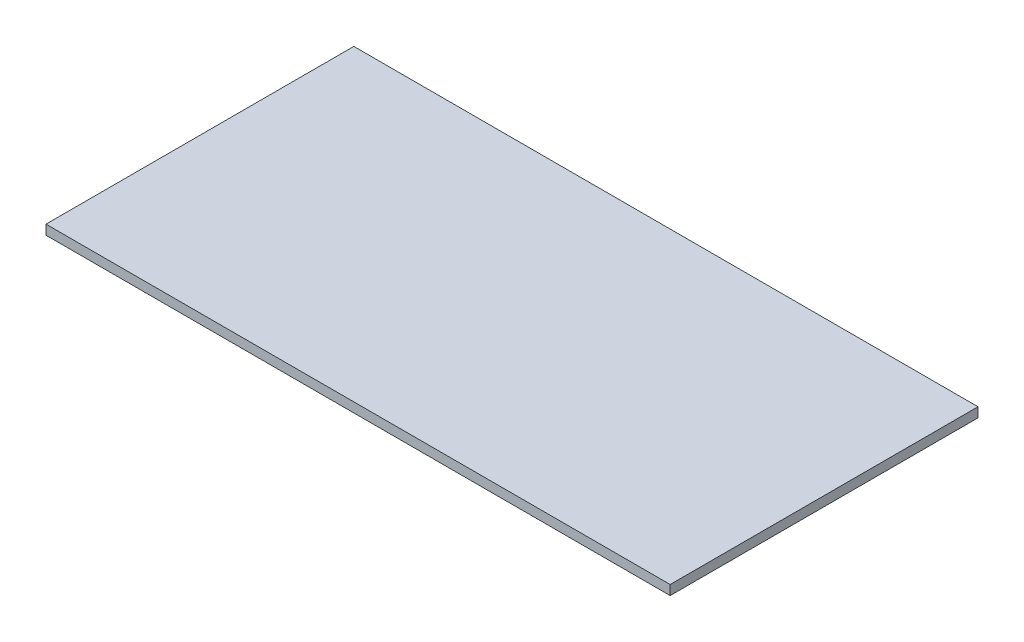
ISO-10303-21;
HEADER;
FILE_DESCRIPTION(('STEP AP214'),'2;1');
FILE_NAME('part.step','',(''),(''),'','','');
FILE_SCHEMA(('AUTOMOTIVE_DESIGN { 1 0 10303 214 1 1 1 1 }'));
ENDSEC;
DATA;
#1=APPLICATION_CONTEXT('core data for automotive mechanical design processes');
#2=APPLICATION_PROTOCOL_DEFINITION('international standard','automotive_design',2000,#1);
#3=PRODUCT_CONTEXT('',#1,'mechanical');
#4=PRODUCT('Part','Part','',(#3));
#5=PRODUCT_RELATED_PRODUCT_CATEGORY('part','',(#4));
#6=PRODUCT_DEFINITION_FORMATION('','',#4);
#7=PRODUCT_DEFINITION_CONTEXT('part definition',#1,'design');
#8=PRODUCT_DEFINITION('design','',#6,#7);
#9=PRODUCT_DEFINITION_SHAPE('','',#8);
#10=(LENGTH_UNIT() NAMED_UNIT(*) SI_UNIT(.MILLI.,.METRE.));
#11=(NAMED_UNIT(*) PLANE_ANGLE_UNIT() SI_UNIT($,.RADIAN.));
#12=(NAMED_UNIT(*) SI_UNIT($,.STERADIAN.) SOLID_ANGLE_UNIT());
#13=UNCERTAINTY_MEASURE_WITH_UNIT(LENGTH_MEASURE(1.E-05),#10,'distance_accuracy_value','');
#14=(GEOMETRIC_REPRESENTATION_CONTEXT(3) GLOBAL_UNCERTAINTY_ASSIGNED_CONTEXT((#13)) GLOBAL_UNIT_ASSIGNED_CONTEXT((#10,
#11,#12)) REPRESENTATION_CONTEXT('',''));
#15=CARTESIAN_POINT('',(0.,0.,0.));
#16=DIRECTION('',(0.,0.,1.));
#17=DIRECTION('',(1.,0.,0.));
#18=AXIS2_PLACEMENT_3D('',#15,#16,#17);
#19=CARTESIAN_POINT('',(-59.1289481870499,4.7625,-123.999481579448));
#20=DIRECTION('',(1.,0.,0.));
#21=DIRECTION('',(0.,0.,-1.));
#22=AXIS2_PLACEMENT_3D('',#19,#20,#21);
#23=PLANE('',#22);
#24=DIRECTION('',(0.,0.,1.));
#25=VECTOR('',#24,1.);
#26=CARTESIAN_POINT('',(-59.1289481870499,0.,-123.999481579448));
#27=LINE('',#26,#25);
#28=CARTESIAN_POINT('',(-59.1289481870499,0.,-123.999481579448));
#29=VERTEX_POINT('',#28);
#30=CARTESIAN_POINT('',(-59.1289481870498,0.,28.4005184205515));
#31=VERTEX_POINT('',#30);
#32=EDGE_CURVE('E98',#29,#31,#27,.T.);
#33=ORIENTED_EDGE('',*,*,#32,.T.);
#34=DIRECTION('',(0.,-1.,0.));
#35=VECTOR('',#34,1.);
#36=CARTESIAN_POINT('',(-59.1289481870498,4.7625,28.4005184205515));
#37=LINE('',#36,#35);
#38=CARTESIAN_POINT('',(-59.1289481870498,4.7625,28.4005184205515));
#39=VERTEX_POINT('',#38);
#40=EDGE_CURVE('E11',#39,#31,#37,.T.);
#41=ORIENTED_EDGE('',*,*,#40,.F.);
#42=DIRECTION('',(0.,0.,1.));
#43=VECTOR('',#42,1.);
#44=CARTESIAN_POINT('',(-59.1289481870499,4.7625,-123.999481579448));
#45=LINE('',#44,#43);
#46=CARTESIAN_POINT('',(-59.1289481870499,4.7625,-123.999481579448));
#47=VERTEX_POINT('',#46);
#48=EDGE_CURVE('E86',#47,#39,#45,.T.);
#49=ORIENTED_EDGE('',*,*,#48,.F.);
#50=DIRECTION('',(0.,-1.,0.));
#51=VECTOR('',#50,1.);
#52=CARTESIAN_POINT('',(-59.1289481870499,4.7625,-123.999481579448));
#53=LINE('',#52,#51);
#54=EDGE_CURVE('E94',#47,#29,#53,.T.);
#55=ORIENTED_EDGE('',*,*,#54,.T.);
#56=EDGE_LOOP('',(#33,#41,#49,#55));
#57=FACE_BOUND('',#56,.T.);
#58=ADVANCED_FACE('F35',(#57),#23,.F.);
#59=CARTESIAN_POINT('',(-59.1289481870498,4.7625,28.4005184205515));
#60=DIRECTION('',(0.,0.,-1.));
#61=DIRECTION('',(-1.,0.,0.));
#62=AXIS2_PLACEMENT_3D('',#59,#60,#61);
#63=PLANE('',#62);
#64=DIRECTION('',(1.,0.,0.));
#65=VECTOR('',#64,1.);
#66=CARTESIAN_POINT('',(-59.1289481870498,0.,28.4005184205515));
#67=LINE('',#66,#65);
#68=CARTESIAN_POINT('',(249.87105181295,0.,28.4005184205515));
#69=VERTEX_POINT('',#68);
#70=EDGE_CURVE('E90',#31,#69,#67,.T.);
#71=ORIENTED_EDGE('',*,*,#70,.T.);
#72=DIRECTION('',(0.,-1.,0.));
#73=VECTOR('',#72,1.);
#74=CARTESIAN_POINT('',(249.87105181295,4.7625,28.4005184205515));
#75=LINE('',#74,#73);
#76=CARTESIAN_POINT('',(249.87105181295,4.7625,28.4005184205515));
#77=VERTEX_POINT('',#76);
#78=EDGE_CURVE('E43',#77,#69,#75,.T.);
#79=ORIENTED_EDGE('',*,*,#78,.F.);
#80=DIRECTION('',(1.,0.,0.));
#81=VECTOR('',#80,1.);
#82=CARTESIAN_POINT('',(-59.1289481870498,4.7625,28.4005184205515));
#83=LINE('',#82,#81);
#84=EDGE_CURVE('E81',#39,#77,#83,.T.);
#85=ORIENTED_EDGE('',*,*,#84,.F.);
#86=ORIENTED_EDGE('',*,*,#40,.T.);
#87=EDGE_LOOP('',(#71,#79,#85,#86));
#88=FACE_BOUND('',#87,.T.);
#89=ADVANCED_FACE('F89',(#88),#63,.F.);
#90=CARTESIAN_POINT('',(249.87105181295,4.7625,-123.999481579448));
#91=DIRECTION('',(-1.,0.,0.));
#92=DIRECTION('',(0.,0.,1.));
#93=AXIS2_PLACEMENT_3D('',#90,#91,#92);
#94=PLANE('',#93);
#95=DIRECTION('',(0.,0.,-1.));
#96=VECTOR('',#95,1.);
#97=CARTESIAN_POINT('',(249.87105181295,0.,-123.999481579448));
#98=LINE('',#97,#96);
#99=CARTESIAN_POINT('',(249.87105181295,0.,-123.999481579448));
#100=VERTEX_POINT('',#99);
#101=EDGE_CURVE('E68',#69,#100,#98,.T.);
#102=ORIENTED_EDGE('',*,*,#101,.T.);
#103=DIRECTION('',(0.,-1.,0.));
#104=VECTOR('',#103,1.);
#105=CARTESIAN_POINT('',(249.87105181295,4.7625,-123.999481579448));
#106=LINE('',#105,#104);
#107=CARTESIAN_POINT('',(249.87105181295,4.7625,-123.999481579448));
#108=VERTEX_POINT('',#107);
#109=EDGE_CURVE('E91',#108,#100,#106,.T.);
#110=ORIENTED_EDGE('',*,*,#109,.F.);
#111=DIRECTION('',(0.,0.,-1.));
#112=VECTOR('',#111,1.);
#113=CARTESIAN_POINT('',(249.87105181295,4.7625,-123.999481579448));
#114=LINE('',#113,#112);
#115=EDGE_CURVE('E84',#77,#108,#114,.T.);
#116=ORIENTED_EDGE('',*,*,#115,.F.);
#117=ORIENTED_EDGE('',*,*,#78,.T.);
#118=EDGE_LOOP('',(#102,#110,#116,#117));
#119=FACE_BOUND('',#118,.T.);
#120=ADVANCED_FACE('F92',(#119),#94,.F.);
#121=CARTESIAN_POINT('',(-59.1289481870499,4.7625,-123.999481579448));
#122=DIRECTION('',(0.,0.,1.));
#123=DIRECTION('',(1.,0.,0.));
#124=AXIS2_PLACEMENT_3D('',#121,#122,#123);
#125=PLANE('',#124);
#126=DIRECTION('',(-1.,0.,0.));
#127=VECTOR('',#126,1.);
#128=CARTESIAN_POINT('',(-59.1289481870499,0.,-123.999481579448));
#129=LINE('',#128,#127);
#130=EDGE_CURVE('E74',#100,#29,#129,.T.);
#131=ORIENTED_EDGE('',*,*,#130,.T.);
#132=ORIENTED_EDGE('',*,*,#54,.F.);
#133=DIRECTION('',(-1.,0.,0.));
#134=VECTOR('',#133,1.);
#135=CARTESIAN_POINT('',(-59.1289481870499,4.7625,-123.999481579448));
#136=LINE('',#135,#134);
#137=EDGE_CURVE('E51',#108,#47,#136,.T.);
#138=ORIENTED_EDGE('',*,*,#137,.F.);
#139=ORIENTED_EDGE('',*,*,#109,.T.);
#140=EDGE_LOOP('',(#131,#132,#138,#139));
#141=FACE_BOUND('',#140,.T.);
#142=ADVANCED_FACE('F105',(#141),#125,.F.);
#143=CARTESIAN_POINT('',(0.,4.7625,0.));
#144=DIRECTION('',(0.,1.,0.));
#145=DIRECTION('',(0.,0.,1.));
#146=AXIS2_PLACEMENT_3D('',#143,#144,#145);
#147=PLANE('',#146);
#148=ORIENTED_EDGE('',*,*,#48,.T.);
#149=ORIENTED_EDGE('',*,*,#84,.T.);
#150=ORIENTED_EDGE('',*,*,#115,.T.);
#151=ORIENTED_EDGE('',*,*,#137,.T.);
#152=EDGE_LOOP('',(#148,#149,#150,#151));
#153=FACE_BOUND('',#152,.T.);
#154=ADVANCED_FACE('F82',(#153),#147,.T.);
#155=CARTESIAN_POINT('',(0.,0.,0.));
#156=DIRECTION('',(0.,1.,0.));
#157=DIRECTION('',(0.,0.,1.));
#158=AXIS2_PLACEMENT_3D('',#155,#156,#157);
#159=PLANE('',#158);
#160=ORIENTED_EDGE('',*,*,#32,.F.);
#161=ORIENTED_EDGE('',*,*,#130,.F.);
#162=ORIENTED_EDGE('',*,*,#101,.F.);
#163=ORIENTED_EDGE('',*,*,#70,.F.);
#164=EDGE_LOOP('',(#160,#161,#162,#163));
#165=FACE_BOUND('',#164,.T.);
#166=ADVANCED_FACE('F108',(#165),#159,.F.);
#167=CLOSED_SHELL('',(#58,#89,#120,#142,#154,#166));
#168=MANIFOLD_SOLID_BREP('B2',#167);
#169=ADVANCED_BREP_SHAPE_REPRESENTATION('',(#18,#168),#14);
#170=SHAPE_DEFINITION_REPRESENTATION(#9,#169);
ENDSEC;
END-ISO-10303-21;
